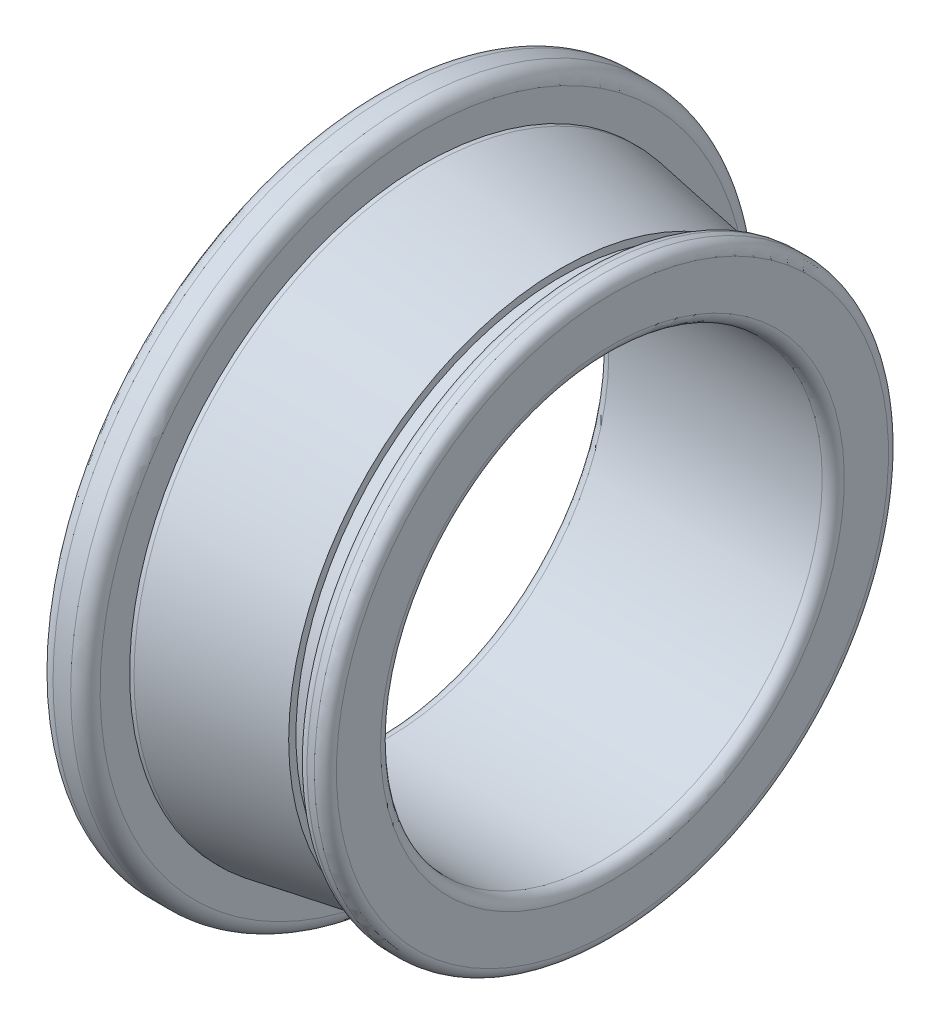
ISO-10303-21;
HEADER;
FILE_DESCRIPTION(('STEP AP214'),'2;1');
FILE_NAME('part.step','',(''),(''),'','','');
FILE_SCHEMA(('AUTOMOTIVE_DESIGN { 1 0 10303 214 1 1 1 1 }'));
ENDSEC;
DATA;
#1=APPLICATION_CONTEXT('core data for automotive mechanical design processes');
#2=APPLICATION_PROTOCOL_DEFINITION('international standard','automotive_design',2000,#1);
#3=PRODUCT_CONTEXT('',#1,'mechanical');
#4=PRODUCT('Part','Part','',(#3));
#5=PRODUCT_RELATED_PRODUCT_CATEGORY('part','',(#4));
#6=PRODUCT_DEFINITION_FORMATION('','',#4);
#7=PRODUCT_DEFINITION_CONTEXT('part definition',#1,'design');
#8=PRODUCT_DEFINITION('design','',#6,#7);
#9=PRODUCT_DEFINITION_SHAPE('','',#8);
#10=(LENGTH_UNIT() NAMED_UNIT(*) SI_UNIT(.MILLI.,.METRE.));
#11=(NAMED_UNIT(*) PLANE_ANGLE_UNIT() SI_UNIT($,.RADIAN.));
#12=(NAMED_UNIT(*) SI_UNIT($,.STERADIAN.) SOLID_ANGLE_UNIT());
#13=UNCERTAINTY_MEASURE_WITH_UNIT(LENGTH_MEASURE(1.E-05),#10,'distance_accuracy_value','');
#14=(GEOMETRIC_REPRESENTATION_CONTEXT(3) GLOBAL_UNCERTAINTY_ASSIGNED_CONTEXT((#13)) GLOBAL_UNIT_ASSIGNED_CONTEXT((#10,
#11,#12)) REPRESENTATION_CONTEXT('',''));
#15=CARTESIAN_POINT('',(0.,0.,0.));
#16=DIRECTION('',(0.,0.,1.));
#17=DIRECTION('',(1.,0.,0.));
#18=AXIS2_PLACEMENT_3D('',#15,#16,#17);
#19=CARTESIAN_POINT('',(-88.5999999999999,0.,0.));
#20=DIRECTION('',(-1.,0.,0.));
#21=DIRECTION('',(0.,0.,1.));
#22=AXIS2_PLACEMENT_3D('',#19,#20,#21);
#23=CONICAL_SURFACE('',#22,20.,0.16580627875);
#24=CARTESIAN_POINT('',(-88.5999999999999,0.,0.));
#25=DIRECTION('',(1.,0.,0.));
#26=DIRECTION('',(0.,0.,-1.));
#27=AXIS2_PLACEMENT_3D('',#24,#25,#26);
#28=CIRCLE('',#27,20.);
#29=CARTESIAN_POINT('',(-88.5999999999999,0.,-20.));
#30=VERTEX_POINT('',#29);
#31=EDGE_CURVE('E392',#30,#30,#28,.F.);
#32=ORIENTED_EDGE('',*,*,#31,.F.);
#33=EDGE_LOOP('',(#32));
#34=FACE_BOUND('',#33,.T.);
#35=CARTESIAN_POINT('',(-79.5999999997146,0.,0.));
#36=DIRECTION('',(-1.,0.,0.));
#37=DIRECTION('',(0.,0.,1.));
#38=AXIS2_PLACEMENT_3D('',#35,#36,#37);
#39=CIRCLE('',#38,18.4939165199724);
#40=CARTESIAN_POINT('',(-79.5999999997146,0.,18.4939165199724));
#41=VERTEX_POINT('',#40);
#42=EDGE_CURVE('E18',#41,#41,#39,.T.);
#43=ORIENTED_EDGE('',*,*,#42,.T.);
#44=EDGE_LOOP('',(#43));
#45=FACE_BOUND('',#44,.T.);
#46=ADVANCED_FACE('F15',(#34,#45),#23,.T.);
#47=CARTESIAN_POINT('',(-79.5999999999999,20.,0.));
#48=DIRECTION('',(-1.,0.,0.));
#49=DIRECTION('',(0.,0.,1.));
#50=AXIS2_PLACEMENT_3D('',#47,#48,#49);
#51=PLANE('',#50);
#52=CARTESIAN_POINT('',(-79.5999999999999,0.,0.));
#53=DIRECTION('',(1.,0.,0.));
#54=DIRECTION('',(0.,0.,-1.));
#55=AXIS2_PLACEMENT_3D('',#52,#53,#54);
#56=CIRCLE('',#55,18.);
#57=CARTESIAN_POINT('',(-79.5999999999999,0.,-18.));
#58=VERTEX_POINT('',#57);
#59=EDGE_CURVE('E386',#58,#58,#56,.T.);
#60=ORIENTED_EDGE('',*,*,#59,.F.);
#61=EDGE_LOOP('',(#60));
#62=FACE_BOUND('',#61,.T.);
#63=ORIENTED_EDGE('',*,*,#42,.F.);
#64=EDGE_LOOP('',(#63));
#65=FACE_BOUND('',#64,.T.);
#66=ADVANCED_FACE('F214',(#62,#65),#51,.F.);
#67=CARTESIAN_POINT('',(-88.8999999999999,0.,0.));
#68=DIRECTION('',(1.,0.,0.));
#69=DIRECTION('',(0.,0.,-1.));
#70=AXIS2_PLACEMENT_3D('',#67,#68,#69);
#71=CYLINDRICAL_SURFACE('',#70,20.);
#72=CARTESIAN_POINT('',(-88.8999999999999,0.,0.));
#73=DIRECTION('',(1.,0.,0.));
#74=DIRECTION('',(0.,0.,-1.));
#75=AXIS2_PLACEMENT_3D('',#72,#73,#74);
#76=CIRCLE('',#75,20.);
#77=CARTESIAN_POINT('',(-88.8999999999999,0.,-20.));
#78=VERTEX_POINT('',#77);
#79=EDGE_CURVE('E382',#78,#78,#76,.T.);
#80=ORIENTED_EDGE('',*,*,#79,.T.);
#81=EDGE_LOOP('',(#80));
#82=FACE_BOUND('',#81,.T.);
#83=ORIENTED_EDGE('',*,*,#31,.T.);
#84=EDGE_LOOP('',(#83));
#85=FACE_BOUND('',#84,.T.);
#86=ADVANCED_FACE('F211',(#82,#85),#71,.T.);
#87=CARTESIAN_POINT('',(-79.5999999999999,0.,0.));
#88=DIRECTION('',(1.,0.,0.));
#89=DIRECTION('',(0.,0.,-1.));
#90=AXIS2_PLACEMENT_3D('',#87,#88,#89);
#91=CYLINDRICAL_SURFACE('',#90,18.);
#92=ORIENTED_EDGE('',*,*,#59,.T.);
#93=EDGE_LOOP('',(#92));
#94=FACE_BOUND('',#93,.T.);
#95=CARTESIAN_POINT('',(-78.0999999999999,0.,0.));
#96=DIRECTION('',(1.,0.,0.));
#97=DIRECTION('',(0.,0.,-1.));
#98=AXIS2_PLACEMENT_3D('',#95,#96,#97);
#99=CIRCLE('',#98,18.);
#100=CARTESIAN_POINT('',(-78.0999999999999,0.,-18.));
#101=VERTEX_POINT('',#100);
#102=EDGE_CURVE('E371',#101,#101,#99,.F.);
#103=ORIENTED_EDGE('',*,*,#102,.T.);
#104=EDGE_LOOP('',(#103));
#105=FACE_BOUND('',#104,.T.);
#106=ADVANCED_FACE('F206',(#94,#105),#91,.T.);
#107=CARTESIAN_POINT('',(-88.8999999999999,0.,1.136868E-13));
#108=DIRECTION('',(-1.,0.,0.));
#109=DIRECTION('',(0.,0.,1.));
#110=AXIS2_PLACEMENT_3D('',#107,#108,#109);
#111=PLANE('',#110);
#112=ORIENTED_EDGE('',*,*,#79,.F.);
#113=EDGE_LOOP('',(#112));
#114=FACE_BOUND('',#113,.T.);
#115=CARTESIAN_POINT('',(-88.8999999999999,0.,0.));
#116=DIRECTION('',(-1.,0.,0.));
#117=DIRECTION('',(0.,1.,0.));
#118=AXIS2_PLACEMENT_3D('',#115,#116,#117);
#119=CIRCLE('',#118,22.);
#120=CARTESIAN_POINT('',(-88.8999999999999,22.,0.));
#121=VERTEX_POINT('',#120);
#122=EDGE_CURVE('E190',#121,#121,#119,.T.);
#123=ORIENTED_EDGE('',*,*,#122,.F.);
#124=EDGE_LOOP('',(#123));
#125=FACE_BOUND('',#124,.T.);
#126=ADVANCED_FACE('F196',(#114,#125),#111,.F.);
#127=CARTESIAN_POINT('',(-78.0999999999999,-1.136868E-13,0.));
#128=DIRECTION('',(1.,0.,0.));
#129=DIRECTION('',(0.,0.,-1.));
#130=AXIS2_PLACEMENT_3D('',#127,#128,#129);
#131=PLANE('',#130);
#132=ORIENTED_EDGE('',*,*,#102,.F.);
#133=EDGE_LOOP('',(#132));
#134=FACE_BOUND('',#133,.T.);
#135=CARTESIAN_POINT('',(-78.0999999999999,0.,0.));
#136=DIRECTION('',(1.,0.,0.));
#137=DIRECTION('',(0.,-1.,0.));
#138=AXIS2_PLACEMENT_3D('',#135,#136,#137);
#139=CIRCLE('',#138,18.75);
#140=CARTESIAN_POINT('',(-78.0999999999999,-18.75,0.));
#141=VERTEX_POINT('',#140);
#142=EDGE_CURVE('E157',#141,#141,#139,.T.);
#143=ORIENTED_EDGE('',*,*,#142,.F.);
#144=EDGE_LOOP('',(#143));
#145=FACE_BOUND('',#144,.T.);
#146=ADVANCED_FACE('F205',(#134,#145),#131,.F.);
#147=CARTESIAN_POINT('',(-89.8999999999999,0.,0.));
#148=DIRECTION('',(-1.,0.,0.));
#149=DIRECTION('',(0.,1.,0.));
#150=AXIS2_PLACEMENT_3D('',#147,#148,#149);
#151=TOROIDAL_SURFACE('',#150,22.,1.);
#152=CARTESIAN_POINT('',(-89.8999999999999,0.,0.));
#153=DIRECTION('',(-1.,0.,0.));
#154=DIRECTION('',(0.,0.,1.));
#155=AXIS2_PLACEMENT_3D('',#152,#153,#154);
#156=CIRCLE('',#155,23.);
#157=CARTESIAN_POINT('',(-89.8999999999999,0.,23.));
#158=VERTEX_POINT('',#157);
#159=EDGE_CURVE('E152',#158,#158,#156,.T.);
#160=ORIENTED_EDGE('',*,*,#159,.F.);
#161=EDGE_LOOP('',(#160));
#162=FACE_BOUND('',#161,.T.);
#163=ORIENTED_EDGE('',*,*,#122,.T.);
#164=EDGE_LOOP('',(#163));
#165=FACE_BOUND('',#164,.T.);
#166=ADVANCED_FACE('F170',(#162,#165),#151,.T.);
#167=CARTESIAN_POINT('',(-77.3499999999999,0.,0.));
#168=DIRECTION('',(1.,0.,0.));
#169=DIRECTION('',(0.,-1.,0.));
#170=AXIS2_PLACEMENT_3D('',#167,#168,#169);
#171=TOROIDAL_SURFACE('',#170,18.75,0.75);
#172=CARTESIAN_POINT('',(-77.3499999999999,0.,0.));
#173=DIRECTION('',(1.,0.,0.));
#174=DIRECTION('',(0.,0.,-1.));
#175=AXIS2_PLACEMENT_3D('',#172,#173,#174);
#176=CIRCLE('',#175,19.5);
#177=CARTESIAN_POINT('',(-77.3499999999999,0.,-19.5));
#178=VERTEX_POINT('',#177);
#179=EDGE_CURVE('E144',#178,#178,#176,.T.);
#180=ORIENTED_EDGE('',*,*,#179,.F.);
#181=EDGE_LOOP('',(#180));
#182=FACE_BOUND('',#181,.T.);
#183=ORIENTED_EDGE('',*,*,#142,.T.);
#184=EDGE_LOOP('',(#183));
#185=FACE_BOUND('',#184,.T.);
#186=ADVANCED_FACE('F165',(#182,#185),#171,.T.);
#187=CARTESIAN_POINT('',(-88.8999999999999,0.,0.));
#188=DIRECTION('',(-1.,0.,0.));
#189=DIRECTION('',(0.,0.,1.));
#190=AXIS2_PLACEMENT_3D('',#187,#188,#189);
#191=CYLINDRICAL_SURFACE('',#190,23.);
#192=ORIENTED_EDGE('',*,*,#159,.T.);
#193=EDGE_LOOP('',(#192));
#194=FACE_BOUND('',#193,.T.);
#195=CARTESIAN_POINT('',(-91.0999999999999,0.,0.));
#196=DIRECTION('',(1.,0.,0.));
#197=DIRECTION('',(0.,-1.,0.));
#198=AXIS2_PLACEMENT_3D('',#195,#196,#197);
#199=CIRCLE('',#198,23.);
#200=CARTESIAN_POINT('',(-91.0999999999999,-23.,0.));
#201=VERTEX_POINT('',#200);
#202=EDGE_CURVE('E113',#201,#201,#199,.F.);
#203=ORIENTED_EDGE('',*,*,#202,.F.);
#204=EDGE_LOOP('',(#203));
#205=FACE_BOUND('',#204,.T.);
#206=ADVANCED_FACE('F169',(#194,#205),#191,.T.);
#207=CARTESIAN_POINT('',(-78.0999999999999,0.,0.));
#208=DIRECTION('',(1.,0.,0.));
#209=DIRECTION('',(0.,0.,-1.));
#210=AXIS2_PLACEMENT_3D('',#207,#208,#209);
#211=CYLINDRICAL_SURFACE('',#210,19.5);
#212=CARTESIAN_POINT('',(-76.8499999999999,0.,0.));
#213=DIRECTION('',(-1.,0.,0.));
#214=DIRECTION('',(0.,1.,0.));
#215=AXIS2_PLACEMENT_3D('',#212,#213,#214);
#216=CIRCLE('',#215,19.5);
#217=CARTESIAN_POINT('',(-76.8499999999999,19.5,0.));
#218=VERTEX_POINT('',#217);
#219=EDGE_CURVE('E110',#218,#218,#216,.F.);
#220=ORIENTED_EDGE('',*,*,#219,.F.);
#221=EDGE_LOOP('',(#220));
#222=FACE_BOUND('',#221,.T.);
#223=ORIENTED_EDGE('',*,*,#179,.T.);
#224=EDGE_LOOP('',(#223));
#225=FACE_BOUND('',#224,.T.);
#226=ADVANCED_FACE('F136',(#222,#225),#211,.T.);
#227=CARTESIAN_POINT('',(-91.0999999999999,0.,0.));
#228=DIRECTION('',(1.,0.,0.));
#229=DIRECTION('',(0.,-1.,0.));
#230=AXIS2_PLACEMENT_3D('',#227,#228,#229);
#231=TOROIDAL_SURFACE('',#230,22.,1.);
#232=ORIENTED_EDGE('',*,*,#202,.T.);
#233=EDGE_LOOP('',(#232));
#234=FACE_BOUND('',#233,.T.);
#235=CARTESIAN_POINT('',(-92.0999999999999,0.,0.));
#236=DIRECTION('',(1.,0.,0.));
#237=DIRECTION('',(0.,1.,0.));
#238=AXIS2_PLACEMENT_3D('',#235,#236,#237);
#239=CIRCLE('',#238,22.);
#240=CARTESIAN_POINT('',(-92.0999999999999,22.,0.));
#241=VERTEX_POINT('',#240);
#242=EDGE_CURVE('E65',#241,#241,#239,.F.);
#243=ORIENTED_EDGE('',*,*,#242,.F.);
#244=EDGE_LOOP('',(#243));
#245=FACE_BOUND('',#244,.T.);
#246=ADVANCED_FACE('F132',(#234,#245),#231,.T.);
#247=CARTESIAN_POINT('',(-76.8499999999999,0.,0.));
#248=DIRECTION('',(-1.,0.,0.));
#249=DIRECTION('',(0.,1.,0.));
#250=AXIS2_PLACEMENT_3D('',#247,#248,#249);
#251=TOROIDAL_SURFACE('',#250,18.75,0.75);
#252=ORIENTED_EDGE('',*,*,#219,.T.);
#253=EDGE_LOOP('',(#252));
#254=FACE_BOUND('',#253,.T.);
#255=CARTESIAN_POINT('',(-76.0999999999999,0.,0.));
#256=DIRECTION('',(-1.,0.,0.));
#257=DIRECTION('',(0.,-1.,0.));
#258=AXIS2_PLACEMENT_3D('',#255,#256,#257);
#259=CIRCLE('',#258,18.75);
#260=CARTESIAN_POINT('',(-76.0999999999999,-18.75,0.));
#261=VERTEX_POINT('',#260);
#262=EDGE_CURVE('E120',#261,#261,#259,.F.);
#263=ORIENTED_EDGE('',*,*,#262,.F.);
#264=EDGE_LOOP('',(#263));
#265=FACE_BOUND('',#264,.T.);
#266=ADVANCED_FACE('F82',(#254,#265),#251,.T.);
#267=CARTESIAN_POINT('',(-92.0999999999999,23.,0.));
#268=DIRECTION('',(-1.,0.,0.));
#269=DIRECTION('',(0.,0.,1.));
#270=AXIS2_PLACEMENT_3D('',#267,#268,#269);
#271=PLANE('',#270);
#272=CARTESIAN_POINT('',(-92.0999999999999,0.,0.));
#273=DIRECTION('',(-1.,0.,0.));
#274=DIRECTION('',(0.,1.,0.));
#275=AXIS2_PLACEMENT_3D('',#272,#273,#274);
#276=CIRCLE('',#275,15.75);
#277=CARTESIAN_POINT('',(-92.0999999999999,15.75,-3.37614338615305E-13));
#278=VERTEX_POINT('',#277);
#279=EDGE_CURVE('E100',#278,#278,#276,.T.);
#280=ORIENTED_EDGE('',*,*,#279,.F.);
#281=EDGE_LOOP('',(#280));
#282=FACE_BOUND('',#281,.T.);
#283=ORIENTED_EDGE('',*,*,#242,.T.);
#284=EDGE_LOOP('',(#283));
#285=FACE_BOUND('',#284,.T.);
#286=ADVANCED_FACE('F72',(#282,#285),#271,.T.);
#287=CARTESIAN_POINT('',(-76.0999999999999,-19.5,0.));
#288=DIRECTION('',(1.,0.,0.));
#289=DIRECTION('',(0.,0.,-1.));
#290=AXIS2_PLACEMENT_3D('',#287,#288,#289);
#291=PLANE('',#290);
#292=CARTESIAN_POINT('',(-76.0999999999999,0.,0.));
#293=DIRECTION('',(1.,0.,0.));
#294=DIRECTION('',(0.,-1.,0.));
#295=AXIS2_PLACEMENT_3D('',#292,#293,#294);
#296=CIRCLE('',#295,15.75);
#297=CARTESIAN_POINT('',(-76.0999999999999,-15.75,0.));
#298=VERTEX_POINT('',#297);
#299=EDGE_CURVE('E27',#298,#298,#296,.T.);
#300=ORIENTED_EDGE('',*,*,#299,.F.);
#301=EDGE_LOOP('',(#300));
#302=FACE_BOUND('',#301,.T.);
#303=ORIENTED_EDGE('',*,*,#262,.T.);
#304=EDGE_LOOP('',(#303));
#305=FACE_BOUND('',#304,.T.);
#306=ADVANCED_FACE('F81',(#302,#305),#291,.T.);
#307=CARTESIAN_POINT('',(-91.3499999999999,0.,0.));
#308=DIRECTION('',(1.,0.,0.));
#309=DIRECTION('',(0.,-1.,0.));
#310=AXIS2_PLACEMENT_3D('',#307,#308,#309);
#311=TOROIDAL_SURFACE('',#310,15.75,0.75);
#312=ORIENTED_EDGE('',*,*,#279,.T.);
#313=EDGE_LOOP('',(#312));
#314=FACE_BOUND('',#313,.T.);
#315=CARTESIAN_POINT('',(-91.3499999999999,0.,0.));
#316=DIRECTION('',(-1.,0.,0.));
#317=DIRECTION('',(0.,0.,1.));
#318=AXIS2_PLACEMENT_3D('',#315,#316,#317);
#319=CIRCLE('',#318,15.);
#320=CARTESIAN_POINT('',(-91.3499999999999,0.,15.));
#321=VERTEX_POINT('',#320);
#322=EDGE_CURVE('E22',#321,#321,#319,.F.);
#323=ORIENTED_EDGE('',*,*,#322,.T.);
#324=EDGE_LOOP('',(#323));
#325=FACE_BOUND('',#324,.T.);
#326=ADVANCED_FACE('F45',(#314,#325),#311,.T.);
#327=CARTESIAN_POINT('',(-76.8499999999999,0.,0.));
#328=DIRECTION('',(-1.,0.,0.));
#329=DIRECTION('',(0.,1.,0.));
#330=AXIS2_PLACEMENT_3D('',#327,#328,#329);
#331=TOROIDAL_SURFACE('',#330,15.75,0.75);
#332=ORIENTED_EDGE('',*,*,#299,.T.);
#333=EDGE_LOOP('',(#332));
#334=FACE_BOUND('',#333,.T.);
#335=CARTESIAN_POINT('',(-76.8499999999999,0.,0.));
#336=DIRECTION('',(-1.,0.,0.));
#337=DIRECTION('',(0.,0.,1.));
#338=AXIS2_PLACEMENT_3D('',#335,#336,#337);
#339=CIRCLE('',#338,15.);
#340=CARTESIAN_POINT('',(-76.8499999999999,0.,15.));
#341=VERTEX_POINT('',#340);
#342=EDGE_CURVE('E10',#341,#341,#339,.T.);
#343=ORIENTED_EDGE('',*,*,#342,.T.);
#344=EDGE_LOOP('',(#343));
#345=FACE_BOUND('',#344,.T.);
#346=ADVANCED_FACE('F39',(#334,#345),#331,.T.);
#347=CARTESIAN_POINT('',(-76.0999999999999,0.,0.));
#348=DIRECTION('',(-1.,0.,0.));
#349=DIRECTION('',(0.,0.,1.));
#350=AXIS2_PLACEMENT_3D('',#347,#348,#349);
#351=CYLINDRICAL_SURFACE('',#350,15.);
#352=ORIENTED_EDGE('',*,*,#342,.F.);
#353=EDGE_LOOP('',(#352));
#354=FACE_BOUND('',#353,.T.);
#355=ORIENTED_EDGE('',*,*,#322,.F.);
#356=EDGE_LOOP('',(#355));
#357=FACE_BOUND('',#356,.T.);
#358=ADVANCED_FACE('F44',(#354,#357),#351,.F.);
#359=CLOSED_SHELL('',(#46,#66,#86,#106,#126,#146,#166,#186,#206,#226,#246,#266,#286,#306,#326,
#346,#358));
#360=MANIFOLD_SOLID_BREP('B1',#359);
#361=ADVANCED_BREP_SHAPE_REPRESENTATION('',(#18,#360),#14);
#362=SHAPE_DEFINITION_REPRESENTATION(#9,#361);
ENDSEC;
END-ISO-10303-21;
